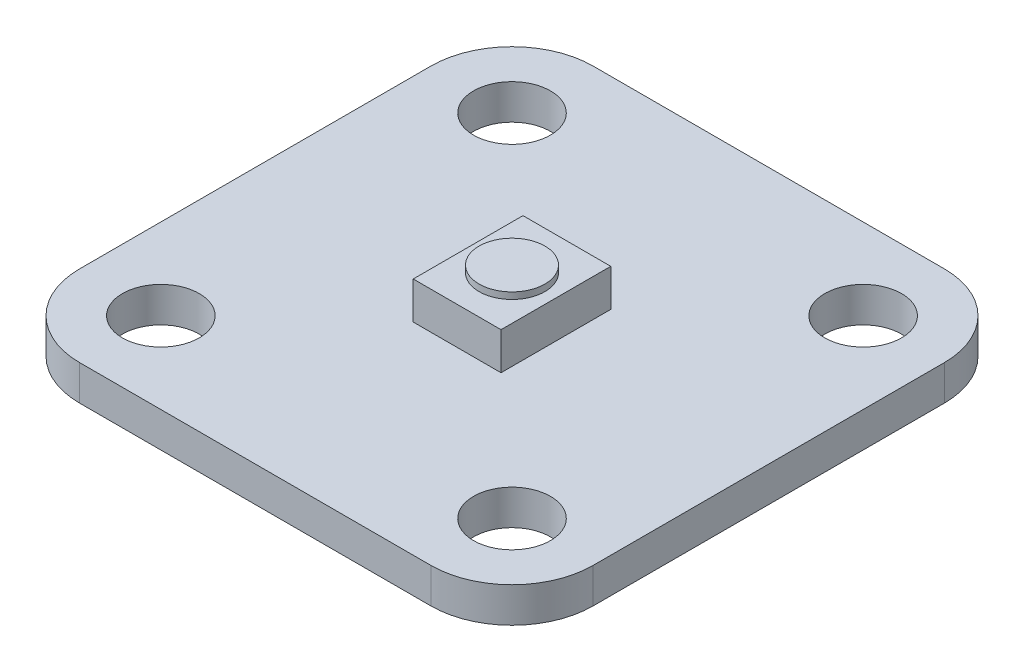
ISO-10303-21;
HEADER;
FILE_DESCRIPTION(('STEP AP214'),'2;1');
FILE_NAME('part.step','',(''),(''),'','','');
FILE_SCHEMA(('AUTOMOTIVE_DESIGN { 1 0 10303 214 1 1 1 1 }'));
ENDSEC;
DATA;
#1=APPLICATION_CONTEXT('core data for automotive mechanical design processes');
#2=APPLICATION_PROTOCOL_DEFINITION('international standard','automotive_design',2000,#1);
#3=PRODUCT_CONTEXT('',#1,'mechanical');
#4=PRODUCT('Part','Part','',(#3));
#5=PRODUCT_RELATED_PRODUCT_CATEGORY('part','',(#4));
#6=PRODUCT_DEFINITION_FORMATION('','',#4);
#7=PRODUCT_DEFINITION_CONTEXT('part definition',#1,'design');
#8=PRODUCT_DEFINITION('design','',#6,#7);
#9=PRODUCT_DEFINITION_SHAPE('','',#8);
#10=(LENGTH_UNIT() NAMED_UNIT(*) SI_UNIT(.MILLI.,.METRE.));
#11=(NAMED_UNIT(*) PLANE_ANGLE_UNIT() SI_UNIT($,.RADIAN.));
#12=(NAMED_UNIT(*) SI_UNIT($,.STERADIAN.) SOLID_ANGLE_UNIT());
#13=UNCERTAINTY_MEASURE_WITH_UNIT(LENGTH_MEASURE(1.E-05),#10,'distance_accuracy_value','');
#14=(GEOMETRIC_REPRESENTATION_CONTEXT(3) GLOBAL_UNCERTAINTY_ASSIGNED_CONTEXT((#13)) GLOBAL_UNIT_ASSIGNED_CONTEXT((#10,
#11,#12)) REPRESENTATION_CONTEXT('',''));
#15=CARTESIAN_POINT('',(0.,0.,0.));
#16=DIRECTION('',(0.,0.,1.));
#17=DIRECTION('',(1.,0.,0.));
#18=AXIS2_PLACEMENT_3D('',#15,#16,#17);
#19=CARTESIAN_POINT('',(3.7,1.6,-19.7));
#20=DIRECTION('',(0.,-1.,0.));
#21=DIRECTION('',(0.,0.,-1.));
#22=AXIS2_PLACEMENT_3D('',#19,#20,#21);
#23=PLANE('',#22);
#24=CARTESIAN_POINT('',(3.7,1.6,-3.69999999999999));
#25=DIRECTION('',(0.,1.,0.));
#26=DIRECTION('',(0.,0.,1.));
#27=AXIS2_PLACEMENT_3D('',#24,#25,#26);
#28=CIRCLE('',#27,1.75);
#29=CARTESIAN_POINT('',(3.7,1.6,-1.95));
#30=VERTEX_POINT('',#29);
#31=EDGE_CURVE('E213',#30,#30,#28,.T.);
#32=ORIENTED_EDGE('',*,*,#31,.F.);
#33=EDGE_LOOP('',(#32));
#34=FACE_BOUND('',#33,.T.);
#35=CARTESIAN_POINT('',(19.7,1.6,-3.69999999999999));
#36=DIRECTION('',(0.,1.,0.));
#37=DIRECTION('',(0.,0.,1.));
#38=AXIS2_PLACEMENT_3D('',#35,#36,#37);
#39=CIRCLE('',#38,1.75);
#40=CARTESIAN_POINT('',(19.7,1.6,-1.94999999999999));
#41=VERTEX_POINT('',#40);
#42=EDGE_CURVE('E207',#41,#41,#39,.T.);
#43=ORIENTED_EDGE('',*,*,#42,.F.);
#44=EDGE_LOOP('',(#43));
#45=FACE_BOUND('',#44,.T.);
#46=CARTESIAN_POINT('',(19.7,1.6,-19.7));
#47=DIRECTION('',(0.,1.,0.));
#48=DIRECTION('',(0.,0.,1.));
#49=AXIS2_PLACEMENT_3D('',#46,#47,#48);
#50=CIRCLE('',#49,1.75);
#51=CARTESIAN_POINT('',(19.7,1.6,-17.95));
#52=VERTEX_POINT('',#51);
#53=EDGE_CURVE('E201',#52,#52,#50,.T.);
#54=ORIENTED_EDGE('',*,*,#53,.F.);
#55=EDGE_LOOP('',(#54));
#56=FACE_BOUND('',#55,.T.);
#57=CARTESIAN_POINT('',(3.7,1.6,-19.7));
#58=DIRECTION('',(0.,1.,0.));
#59=DIRECTION('',(0.,0.,1.));
#60=AXIS2_PLACEMENT_3D('',#57,#58,#59);
#61=CIRCLE('',#60,1.75);
#62=CARTESIAN_POINT('',(3.7,1.6,-17.95));
#63=VERTEX_POINT('',#62);
#64=EDGE_CURVE('E149',#63,#63,#61,.T.);
#65=ORIENTED_EDGE('',*,*,#64,.F.);
#66=EDGE_LOOP('',(#65));
#67=FACE_BOUND('',#66,.T.);
#68=CARTESIAN_POINT('',(3.7,1.6,-19.7));
#69=DIRECTION('',(0.,1.,0.));
#70=DIRECTION('',(0.,0.,-1.));
#71=AXIS2_PLACEMENT_3D('',#68,#69,#70);
#72=CIRCLE('',#71,3.7);
#73=CARTESIAN_POINT('',(3.70000000000003,1.6,-23.4));
#74=VERTEX_POINT('',#73);
#75=CARTESIAN_POINT('',(0.,1.6,-19.7));
#76=VERTEX_POINT('',#75);
#77=EDGE_CURVE('E161',#74,#76,#72,.T.);
#78=ORIENTED_EDGE('',*,*,#77,.T.);
#79=DIRECTION('',(0.,0.,1.));
#80=VECTOR('',#79,1.);
#81=CARTESIAN_POINT('',(0.,1.6,-3.70000000000003));
#82=LINE('',#81,#80);
#83=CARTESIAN_POINT('',(0.,1.6,-3.70000000000003));
#84=VERTEX_POINT('',#83);
#85=EDGE_CURVE('E101',#76,#84,#82,.T.);
#86=ORIENTED_EDGE('',*,*,#85,.T.);
#87=CARTESIAN_POINT('',(3.7,1.6,-3.7));
#88=DIRECTION('',(0.,1.,0.));
#89=DIRECTION('',(0.,0.,-1.));
#90=AXIS2_PLACEMENT_3D('',#87,#88,#89);
#91=CIRCLE('',#90,3.7);
#92=CARTESIAN_POINT('',(3.70000000000003,1.6,0.));
#93=VERTEX_POINT('',#92);
#94=EDGE_CURVE('E192',#84,#93,#91,.T.);
#95=ORIENTED_EDGE('',*,*,#94,.T.);
#96=DIRECTION('',(1.,0.,0.));
#97=VECTOR('',#96,1.);
#98=CARTESIAN_POINT('',(3.70000000000003,1.6,0.));
#99=LINE('',#98,#97);
#100=CARTESIAN_POINT('',(19.7,1.6,0.));
#101=VERTEX_POINT('',#100);
#102=EDGE_CURVE('E191',#93,#101,#99,.T.);
#103=ORIENTED_EDGE('',*,*,#102,.T.);
#104=CARTESIAN_POINT('',(19.7,1.6,-3.7));
#105=DIRECTION('',(0.,1.,0.));
#106=DIRECTION('',(0.,0.,1.));
#107=AXIS2_PLACEMENT_3D('',#104,#105,#106);
#108=CIRCLE('',#107,3.7);
#109=CARTESIAN_POINT('',(23.4,1.6,-3.70000000000003));
#110=VERTEX_POINT('',#109);
#111=EDGE_CURVE('E124',#101,#110,#108,.T.);
#112=ORIENTED_EDGE('',*,*,#111,.T.);
#113=DIRECTION('',(0.,0.,-1.));
#114=VECTOR('',#113,1.);
#115=CARTESIAN_POINT('',(23.4,1.6,-3.70000000000003));
#116=LINE('',#115,#114);
#117=CARTESIAN_POINT('',(23.4,1.6,-19.7));
#118=VERTEX_POINT('',#117);
#119=EDGE_CURVE('E117',#110,#118,#116,.T.);
#120=ORIENTED_EDGE('',*,*,#119,.T.);
#121=CARTESIAN_POINT('',(19.7,1.6,-19.7));
#122=DIRECTION('',(0.,1.,0.));
#123=DIRECTION('',(0.,0.,-1.));
#124=AXIS2_PLACEMENT_3D('',#121,#122,#123);
#125=CIRCLE('',#124,3.7);
#126=CARTESIAN_POINT('',(19.7,1.6,-23.4));
#127=VERTEX_POINT('',#126);
#128=EDGE_CURVE('E121',#118,#127,#125,.T.);
#129=ORIENTED_EDGE('',*,*,#128,.T.);
#130=DIRECTION('',(-1.,0.,0.));
#131=VECTOR('',#130,1.);
#132=CARTESIAN_POINT('',(3.70000000000003,1.6,-23.4));
#133=LINE('',#132,#131);
#134=EDGE_CURVE('E59',#127,#74,#133,.T.);
#135=ORIENTED_EDGE('',*,*,#134,.T.);
#136=EDGE_LOOP('',(#78,#86,#95,#103,#112,#120,#129,#135));
#137=FACE_BOUND('',#136,.T.);
#138=DIRECTION('',(1.,0.,0.));
#139=VECTOR('',#138,1.);
#140=CARTESIAN_POINT('',(0.,1.6,-9.2));
#141=LINE('',#140,#139);
#142=CARTESIAN_POINT('',(9.7,1.6,-9.2));
#143=VERTEX_POINT('',#142);
#144=CARTESIAN_POINT('',(13.7,1.6,-9.2));
#145=VERTEX_POINT('',#144);
#146=EDGE_CURVE('E240',#143,#145,#141,.T.);
#147=ORIENTED_EDGE('',*,*,#146,.F.);
#148=DIRECTION('',(0.,0.,-1.));
#149=VECTOR('',#148,1.);
#150=CARTESIAN_POINT('',(9.7,1.6,0.));
#151=LINE('',#150,#149);
#152=CARTESIAN_POINT('',(9.7,1.6,-14.2));
#153=VERTEX_POINT('',#152);
#154=EDGE_CURVE('E232',#143,#153,#151,.T.);
#155=ORIENTED_EDGE('',*,*,#154,.T.);
#156=DIRECTION('',(1.,0.,0.));
#157=VECTOR('',#156,1.);
#158=CARTESIAN_POINT('',(0.,1.6,-14.2));
#159=LINE('',#158,#157);
#160=CARTESIAN_POINT('',(13.7,1.6,-14.2));
#161=VERTEX_POINT('',#160);
#162=EDGE_CURVE('E50',#153,#161,#159,.T.);
#163=ORIENTED_EDGE('',*,*,#162,.T.);
#164=DIRECTION('',(0.,0.,-1.));
#165=VECTOR('',#164,1.);
#166=CARTESIAN_POINT('',(13.7,1.6,0.));
#167=LINE('',#166,#165);
#168=EDGE_CURVE('E237',#145,#161,#167,.T.);
#169=ORIENTED_EDGE('',*,*,#168,.F.);
#170=EDGE_LOOP('',(#147,#155,#163,#169));
#171=FACE_BOUND('',#170,.T.);
#172=ADVANCED_FACE('F34',(#34,#45,#56,#67,#137,#171),#23,.F.);
#173=CARTESIAN_POINT('',(3.7,0.,-19.7));
#174=DIRECTION('',(0.,-1.,0.));
#175=DIRECTION('',(0.,0.,-1.));
#176=AXIS2_PLACEMENT_3D('',#173,#174,#175);
#177=PLANE('',#176);
#178=CARTESIAN_POINT('',(19.7,0.,-3.69999999999999));
#179=DIRECTION('',(0.,1.,0.));
#180=DIRECTION('',(0.,0.,1.));
#181=AXIS2_PLACEMENT_3D('',#178,#179,#180);
#182=CIRCLE('',#181,1.75);
#183=CARTESIAN_POINT('',(19.7,0.,-1.94999999999999));
#184=VERTEX_POINT('',#183);
#185=EDGE_CURVE('E210',#184,#184,#182,.T.);
#186=ORIENTED_EDGE('',*,*,#185,.T.);
#187=EDGE_LOOP('',(#186));
#188=FACE_BOUND('',#187,.T.);
#189=CARTESIAN_POINT('',(3.7,0.,-19.7));
#190=DIRECTION('',(0.,1.,0.));
#191=DIRECTION('',(0.,0.,1.));
#192=AXIS2_PLACEMENT_3D('',#189,#190,#191);
#193=CIRCLE('',#192,1.75);
#194=CARTESIAN_POINT('',(3.7,0.,-17.95));
#195=VERTEX_POINT('',#194);
#196=EDGE_CURVE('E198',#195,#195,#193,.T.);
#197=ORIENTED_EDGE('',*,*,#196,.T.);
#198=EDGE_LOOP('',(#197));
#199=FACE_BOUND('',#198,.T.);
#200=CARTESIAN_POINT('',(3.7,0.,-19.7));
#201=DIRECTION('',(0.,1.,0.));
#202=DIRECTION('',(0.,0.,-1.));
#203=AXIS2_PLACEMENT_3D('',#200,#201,#202);
#204=CIRCLE('',#203,3.7);
#205=CARTESIAN_POINT('',(3.70000000000003,0.,-23.4));
#206=VERTEX_POINT('',#205);
#207=CARTESIAN_POINT('',(0.,0.,-19.7));
#208=VERTEX_POINT('',#207);
#209=EDGE_CURVE('E145',#206,#208,#204,.T.);
#210=ORIENTED_EDGE('',*,*,#209,.F.);
#211=DIRECTION('',(-1.,0.,0.));
#212=VECTOR('',#211,1.);
#213=CARTESIAN_POINT('',(3.70000000000003,0.,-23.4));
#214=LINE('',#213,#212);
#215=CARTESIAN_POINT('',(19.7,0.,-23.4));
#216=VERTEX_POINT('',#215);
#217=EDGE_CURVE('E92',#216,#206,#214,.T.);
#218=ORIENTED_EDGE('',*,*,#217,.F.);
#219=CARTESIAN_POINT('',(19.7,0.,-19.7));
#220=DIRECTION('',(0.,1.,0.));
#221=DIRECTION('',(0.,0.,-1.));
#222=AXIS2_PLACEMENT_3D('',#219,#220,#221);
#223=CIRCLE('',#222,3.7);
#224=CARTESIAN_POINT('',(23.4,0.,-19.7));
#225=VERTEX_POINT('',#224);
#226=EDGE_CURVE('E158',#225,#216,#223,.T.);
#227=ORIENTED_EDGE('',*,*,#226,.F.);
#228=DIRECTION('',(0.,0.,-1.));
#229=VECTOR('',#228,1.);
#230=CARTESIAN_POINT('',(23.4,0.,-3.70000000000003));
#231=LINE('',#230,#229);
#232=CARTESIAN_POINT('',(23.4,0.,-3.70000000000003));
#233=VERTEX_POINT('',#232);
#234=EDGE_CURVE('E133',#233,#225,#231,.T.);
#235=ORIENTED_EDGE('',*,*,#234,.F.);
#236=CARTESIAN_POINT('',(19.7,0.,-3.7));
#237=DIRECTION('',(0.,1.,0.));
#238=DIRECTION('',(0.,0.,1.));
#239=AXIS2_PLACEMENT_3D('',#236,#237,#238);
#240=CIRCLE('',#239,3.7);
#241=CARTESIAN_POINT('',(19.7,0.,0.));
#242=VERTEX_POINT('',#241);
#243=EDGE_CURVE('E155',#242,#233,#240,.T.);
#244=ORIENTED_EDGE('',*,*,#243,.F.);
#245=DIRECTION('',(1.,0.,0.));
#246=VECTOR('',#245,1.);
#247=CARTESIAN_POINT('',(3.70000000000003,0.,0.));
#248=LINE('',#247,#246);
#249=CARTESIAN_POINT('',(3.70000000000003,0.,0.));
#250=VERTEX_POINT('',#249);
#251=EDGE_CURVE('E153',#250,#242,#248,.T.);
#252=ORIENTED_EDGE('',*,*,#251,.F.);
#253=CARTESIAN_POINT('',(3.7,0.,-3.7));
#254=DIRECTION('',(0.,1.,0.));
#255=DIRECTION('',(0.,0.,-1.));
#256=AXIS2_PLACEMENT_3D('',#253,#254,#255);
#257=CIRCLE('',#256,3.7);
#258=CARTESIAN_POINT('',(0.,0.,-3.70000000000003));
#259=VERTEX_POINT('',#258);
#260=EDGE_CURVE('E151',#259,#250,#257,.T.);
#261=ORIENTED_EDGE('',*,*,#260,.F.);
#262=DIRECTION('',(0.,0.,1.));
#263=VECTOR('',#262,1.);
#264=CARTESIAN_POINT('',(0.,0.,-3.70000000000003));
#265=LINE('',#264,#263);
#266=EDGE_CURVE('E148',#208,#259,#265,.T.);
#267=ORIENTED_EDGE('',*,*,#266,.F.);
#268=EDGE_LOOP('',(#210,#218,#227,#235,#244,#252,#261,#267));
#269=FACE_BOUND('',#268,.T.);
#270=CARTESIAN_POINT('',(19.7,0.,-19.7));
#271=DIRECTION('',(0.,1.,0.));
#272=DIRECTION('',(0.,0.,1.));
#273=AXIS2_PLACEMENT_3D('',#270,#271,#272);
#274=CIRCLE('',#273,1.75);
#275=CARTESIAN_POINT('',(19.7,0.,-17.95));
#276=VERTEX_POINT('',#275);
#277=EDGE_CURVE('E204',#276,#276,#274,.T.);
#278=ORIENTED_EDGE('',*,*,#277,.T.);
#279=EDGE_LOOP('',(#278));
#280=FACE_BOUND('',#279,.T.);
#281=CARTESIAN_POINT('',(3.7,0.,-3.69999999999999));
#282=DIRECTION('',(0.,1.,0.));
#283=DIRECTION('',(0.,0.,1.));
#284=AXIS2_PLACEMENT_3D('',#281,#282,#283);
#285=CIRCLE('',#284,1.75);
#286=CARTESIAN_POINT('',(3.7,0.,-1.95));
#287=VERTEX_POINT('',#286);
#288=EDGE_CURVE('E216',#287,#287,#285,.T.);
#289=ORIENTED_EDGE('',*,*,#288,.T.);
#290=EDGE_LOOP('',(#289));
#291=FACE_BOUND('',#290,.T.);
#292=ADVANCED_FACE('F181',(#188,#199,#269,#280,#291),#177,.T.);
#293=CARTESIAN_POINT('',(3.7,1.6,-19.7));
#294=DIRECTION('',(0.,-1.,0.));
#295=DIRECTION('',(0.,0.,-1.));
#296=AXIS2_PLACEMENT_3D('',#293,#294,#295);
#297=CYLINDRICAL_SURFACE('',#296,3.7);
#298=ORIENTED_EDGE('',*,*,#209,.T.);
#299=DIRECTION('',(0.,-1.,0.));
#300=VECTOR('',#299,1.);
#301=CARTESIAN_POINT('',(0.,1.6,-19.7));
#302=LINE('',#301,#300);
#303=EDGE_CURVE('E38',#76,#208,#302,.T.);
#304=ORIENTED_EDGE('',*,*,#303,.F.);
#305=ORIENTED_EDGE('',*,*,#77,.F.);
#306=DIRECTION('',(0.,-1.,0.));
#307=VECTOR('',#306,1.);
#308=CARTESIAN_POINT('',(3.70000000000003,1.6,-23.4));
#309=LINE('',#308,#307);
#310=EDGE_CURVE('E141',#74,#206,#309,.T.);
#311=ORIENTED_EDGE('',*,*,#310,.T.);
#312=EDGE_LOOP('',(#298,#304,#305,#311));
#313=FACE_BOUND('',#312,.T.);
#314=ADVANCED_FACE('F36',(#313),#297,.T.);
#315=CARTESIAN_POINT('',(0.,1.6,-3.70000000000003));
#316=DIRECTION('',(1.,0.,0.));
#317=DIRECTION('',(0.,0.,-1.));
#318=AXIS2_PLACEMENT_3D('',#315,#316,#317);
#319=PLANE('',#318);
#320=ORIENTED_EDGE('',*,*,#266,.T.);
#321=DIRECTION('',(0.,-1.,0.));
#322=VECTOR('',#321,1.);
#323=CARTESIAN_POINT('',(0.,1.6,-3.70000000000003));
#324=LINE('',#323,#322);
#325=EDGE_CURVE('E170',#84,#259,#324,.T.);
#326=ORIENTED_EDGE('',*,*,#325,.F.);
#327=ORIENTED_EDGE('',*,*,#85,.F.);
#328=ORIENTED_EDGE('',*,*,#303,.T.);
#329=EDGE_LOOP('',(#320,#326,#327,#328));
#330=FACE_BOUND('',#329,.T.);
#331=ADVANCED_FACE('F176',(#330),#319,.F.);
#332=CARTESIAN_POINT('',(3.7,1.6,-3.7));
#333=DIRECTION('',(0.,-1.,0.));
#334=DIRECTION('',(0.,0.,-1.));
#335=AXIS2_PLACEMENT_3D('',#332,#333,#334);
#336=CYLINDRICAL_SURFACE('',#335,3.7);
#337=ORIENTED_EDGE('',*,*,#260,.T.);
#338=DIRECTION('',(0.,-1.,0.));
#339=VECTOR('',#338,1.);
#340=CARTESIAN_POINT('',(3.70000000000003,1.6,0.));
#341=LINE('',#340,#339);
#342=EDGE_CURVE('E168',#93,#250,#341,.T.);
#343=ORIENTED_EDGE('',*,*,#342,.F.);
#344=ORIENTED_EDGE('',*,*,#94,.F.);
#345=ORIENTED_EDGE('',*,*,#325,.T.);
#346=EDGE_LOOP('',(#337,#343,#344,#345));
#347=FACE_BOUND('',#346,.T.);
#348=ADVANCED_FACE('F186',(#347),#336,.T.);
#349=CARTESIAN_POINT('',(3.70000000000003,1.6,0.));
#350=DIRECTION('',(0.,0.,-1.));
#351=DIRECTION('',(-1.,0.,0.));
#352=AXIS2_PLACEMENT_3D('',#349,#350,#351);
#353=PLANE('',#352);
#354=ORIENTED_EDGE('',*,*,#251,.T.);
#355=DIRECTION('',(0.,-1.,0.));
#356=VECTOR('',#355,1.);
#357=CARTESIAN_POINT('',(19.7,1.6,0.));
#358=LINE('',#357,#356);
#359=EDGE_CURVE('E165',#101,#242,#358,.T.);
#360=ORIENTED_EDGE('',*,*,#359,.F.);
#361=ORIENTED_EDGE('',*,*,#102,.F.);
#362=ORIENTED_EDGE('',*,*,#342,.T.);
#363=EDGE_LOOP('',(#354,#360,#361,#362));
#364=FACE_BOUND('',#363,.T.);
#365=ADVANCED_FACE('F189',(#364),#353,.F.);
#366=CARTESIAN_POINT('',(19.7,1.6,-3.7));
#367=DIRECTION('',(0.,-1.,0.));
#368=DIRECTION('',(0.,0.,-1.));
#369=AXIS2_PLACEMENT_3D('',#366,#367,#368);
#370=CYLINDRICAL_SURFACE('',#369,3.7);
#371=ORIENTED_EDGE('',*,*,#243,.T.);
#372=DIRECTION('',(0.,-1.,0.));
#373=VECTOR('',#372,1.);
#374=CARTESIAN_POINT('',(23.4,1.6,-3.70000000000003));
#375=LINE('',#374,#373);
#376=EDGE_CURVE('E136',#110,#233,#375,.T.);
#377=ORIENTED_EDGE('',*,*,#376,.F.);
#378=ORIENTED_EDGE('',*,*,#111,.F.);
#379=ORIENTED_EDGE('',*,*,#359,.T.);
#380=EDGE_LOOP('',(#371,#377,#378,#379));
#381=FACE_BOUND('',#380,.T.);
#382=ADVANCED_FACE('F317',(#381),#370,.T.);
#383=CARTESIAN_POINT('',(23.4,1.6,-3.70000000000003));
#384=DIRECTION('',(-1.,0.,0.));
#385=DIRECTION('',(0.,0.,1.));
#386=AXIS2_PLACEMENT_3D('',#383,#384,#385);
#387=PLANE('',#386);
#388=ORIENTED_EDGE('',*,*,#234,.T.);
#389=DIRECTION('',(0.,-1.,0.));
#390=VECTOR('',#389,1.);
#391=CARTESIAN_POINT('',(23.4,1.6,-19.7));
#392=LINE('',#391,#390);
#393=EDGE_CURVE('E130',#118,#225,#392,.T.);
#394=ORIENTED_EDGE('',*,*,#393,.F.);
#395=ORIENTED_EDGE('',*,*,#119,.F.);
#396=ORIENTED_EDGE('',*,*,#376,.T.);
#397=EDGE_LOOP('',(#388,#394,#395,#396));
#398=FACE_BOUND('',#397,.T.);
#399=ADVANCED_FACE('F131',(#398),#387,.F.);
#400=CARTESIAN_POINT('',(19.7,1.6,-19.7));
#401=DIRECTION('',(0.,-1.,0.));
#402=DIRECTION('',(0.,0.,-1.));
#403=AXIS2_PLACEMENT_3D('',#400,#401,#402);
#404=CYLINDRICAL_SURFACE('',#403,3.7);
#405=ORIENTED_EDGE('',*,*,#226,.T.);
#406=DIRECTION('',(0.,-1.,0.));
#407=VECTOR('',#406,1.);
#408=CARTESIAN_POINT('',(19.7,1.6,-23.4));
#409=LINE('',#408,#407);
#410=EDGE_CURVE('E137',#127,#216,#409,.T.);
#411=ORIENTED_EDGE('',*,*,#410,.F.);
#412=ORIENTED_EDGE('',*,*,#128,.F.);
#413=ORIENTED_EDGE('',*,*,#393,.T.);
#414=EDGE_LOOP('',(#405,#411,#412,#413));
#415=FACE_BOUND('',#414,.T.);
#416=ADVANCED_FACE('F139',(#415),#404,.T.);
#417=CARTESIAN_POINT('',(3.70000000000003,1.6,-23.4));
#418=DIRECTION('',(0.,0.,1.));
#419=DIRECTION('',(1.,0.,0.));
#420=AXIS2_PLACEMENT_3D('',#417,#418,#419);
#421=PLANE('',#420);
#422=ORIENTED_EDGE('',*,*,#217,.T.);
#423=ORIENTED_EDGE('',*,*,#310,.F.);
#424=ORIENTED_EDGE('',*,*,#134,.F.);
#425=ORIENTED_EDGE('',*,*,#410,.T.);
#426=EDGE_LOOP('',(#422,#423,#424,#425));
#427=FACE_BOUND('',#426,.T.);
#428=ADVANCED_FACE('F310',(#427),#421,.F.);
#429=CARTESIAN_POINT('',(3.7,1.6,-19.7));
#430=DIRECTION('',(0.,-1.,0.));
#431=DIRECTION('',(0.,0.,-1.));
#432=AXIS2_PLACEMENT_3D('',#429,#430,#431);
#433=CYLINDRICAL_SURFACE('',#432,1.75);
#434=ORIENTED_EDGE('',*,*,#64,.T.);
#435=EDGE_LOOP('',(#434));
#436=FACE_BOUND('',#435,.T.);
#437=ORIENTED_EDGE('',*,*,#196,.F.);
#438=EDGE_LOOP('',(#437));
#439=FACE_BOUND('',#438,.T.);
#440=ADVANCED_FACE('F307',(#436,#439),#433,.F.);
#441=CARTESIAN_POINT('',(19.7,1.6,-19.7));
#442=DIRECTION('',(0.,-1.,0.));
#443=DIRECTION('',(0.,0.,-1.));
#444=AXIS2_PLACEMENT_3D('',#441,#442,#443);
#445=CYLINDRICAL_SURFACE('',#444,1.75);
#446=ORIENTED_EDGE('',*,*,#53,.T.);
#447=EDGE_LOOP('',(#446));
#448=FACE_BOUND('',#447,.T.);
#449=ORIENTED_EDGE('',*,*,#277,.F.);
#450=EDGE_LOOP('',(#449));
#451=FACE_BOUND('',#450,.T.);
#452=ADVANCED_FACE('F380',(#448,#451),#445,.F.);
#453=CARTESIAN_POINT('',(19.7,1.6,-3.69999999999999));
#454=DIRECTION('',(0.,-1.,0.));
#455=DIRECTION('',(0.,0.,-1.));
#456=AXIS2_PLACEMENT_3D('',#453,#454,#455);
#457=CYLINDRICAL_SURFACE('',#456,1.75);
#458=ORIENTED_EDGE('',*,*,#42,.T.);
#459=EDGE_LOOP('',(#458));
#460=FACE_BOUND('',#459,.T.);
#461=ORIENTED_EDGE('',*,*,#185,.F.);
#462=EDGE_LOOP('',(#461));
#463=FACE_BOUND('',#462,.T.);
#464=ADVANCED_FACE('F388',(#460,#463),#457,.F.);
#465=CARTESIAN_POINT('',(3.7,1.6,-3.69999999999999));
#466=DIRECTION('',(0.,-1.,0.));
#467=DIRECTION('',(0.,0.,-1.));
#468=AXIS2_PLACEMENT_3D('',#465,#466,#467);
#469=CYLINDRICAL_SURFACE('',#468,1.75);
#470=ORIENTED_EDGE('',*,*,#31,.T.);
#471=EDGE_LOOP('',(#470));
#472=FACE_BOUND('',#471,.T.);
#473=ORIENTED_EDGE('',*,*,#288,.F.);
#474=EDGE_LOOP('',(#473));
#475=FACE_BOUND('',#474,.T.);
#476=ADVANCED_FACE('F396',(#472,#475),#469,.F.);
#477=CARTESIAN_POINT('',(0.,3.3,-9.2));
#478=DIRECTION('',(0.,0.,-1.));
#479=DIRECTION('',(-1.,0.,0.));
#480=AXIS2_PLACEMENT_3D('',#477,#478,#479);
#481=PLANE('',#480);
#482=ORIENTED_EDGE('',*,*,#146,.T.);
#483=DIRECTION('',(0.,-1.,0.));
#484=VECTOR('',#483,1.);
#485=CARTESIAN_POINT('',(13.7,3.3,-9.2));
#486=LINE('',#485,#484);
#487=CARTESIAN_POINT('',(13.7,3.3,-9.2));
#488=VERTEX_POINT('',#487);
#489=EDGE_CURVE('E219',#488,#145,#486,.T.);
#490=ORIENTED_EDGE('',*,*,#489,.F.);
#491=DIRECTION('',(1.,0.,0.));
#492=VECTOR('',#491,1.);
#493=CARTESIAN_POINT('',(0.,3.3,-9.2));
#494=LINE('',#493,#492);
#495=CARTESIAN_POINT('',(9.7,3.3,-9.2));
#496=VERTEX_POINT('',#495);
#497=EDGE_CURVE('E235',#496,#488,#494,.T.);
#498=ORIENTED_EDGE('',*,*,#497,.F.);
#499=DIRECTION('',(0.,-1.,0.));
#500=VECTOR('',#499,1.);
#501=CARTESIAN_POINT('',(9.7,3.3,-9.2));
#502=LINE('',#501,#500);
#503=EDGE_CURVE('E228',#496,#143,#502,.T.);
#504=ORIENTED_EDGE('',*,*,#503,.T.);
#505=EDGE_LOOP('',(#482,#490,#498,#504));
#506=FACE_BOUND('',#505,.T.);
#507=ADVANCED_FACE('F280',(#506),#481,.F.);
#508=CARTESIAN_POINT('',(13.7,3.3,0.));
#509=DIRECTION('',(-1.,0.,0.));
#510=DIRECTION('',(0.,0.,1.));
#511=AXIS2_PLACEMENT_3D('',#508,#509,#510);
#512=PLANE('',#511);
#513=ORIENTED_EDGE('',*,*,#168,.T.);
#514=DIRECTION('',(0.,-1.,0.));
#515=VECTOR('',#514,1.);
#516=CARTESIAN_POINT('',(13.7,3.3,-14.2));
#517=LINE('',#516,#515);
#518=CARTESIAN_POINT('',(13.7,3.3,-14.2));
#519=VERTEX_POINT('',#518);
#520=EDGE_CURVE('E224',#519,#161,#517,.T.);
#521=ORIENTED_EDGE('',*,*,#520,.F.);
#522=DIRECTION('',(0.,0.,-1.));
#523=VECTOR('',#522,1.);
#524=CARTESIAN_POINT('',(13.7,3.3,0.));
#525=LINE('',#524,#523);
#526=EDGE_CURVE('E249',#488,#519,#525,.T.);
#527=ORIENTED_EDGE('',*,*,#526,.F.);
#528=ORIENTED_EDGE('',*,*,#489,.T.);
#529=EDGE_LOOP('',(#513,#521,#527,#528));
#530=FACE_BOUND('',#529,.T.);
#531=ADVANCED_FACE('F285',(#530),#512,.F.);
#532=CARTESIAN_POINT('',(0.,3.3,-14.2));
#533=DIRECTION('',(0.,0.,-1.));
#534=DIRECTION('',(-1.,0.,0.));
#535=AXIS2_PLACEMENT_3D('',#532,#533,#534);
#536=PLANE('',#535);
#537=ORIENTED_EDGE('',*,*,#162,.F.);
#538=DIRECTION('',(0.,-1.,0.));
#539=VECTOR('',#538,1.);
#540=CARTESIAN_POINT('',(9.7,3.3,-14.2));
#541=LINE('',#540,#539);
#542=CARTESIAN_POINT('',(9.7,3.3,-14.2));
#543=VERTEX_POINT('',#542);
#544=EDGE_CURVE('E226',#543,#153,#541,.T.);
#545=ORIENTED_EDGE('',*,*,#544,.F.);
#546=DIRECTION('',(1.,0.,0.));
#547=VECTOR('',#546,1.);
#548=CARTESIAN_POINT('',(0.,3.3,-14.2));
#549=LINE('',#548,#547);
#550=EDGE_CURVE('E246',#543,#519,#549,.T.);
#551=ORIENTED_EDGE('',*,*,#550,.T.);
#552=ORIENTED_EDGE('',*,*,#520,.T.);
#553=EDGE_LOOP('',(#537,#545,#551,#552));
#554=FACE_BOUND('',#553,.T.);
#555=ADVANCED_FACE('F293',(#554),#536,.T.);
#556=CARTESIAN_POINT('',(9.7,3.3,0.));
#557=DIRECTION('',(-1.,0.,0.));
#558=DIRECTION('',(0.,0.,1.));
#559=AXIS2_PLACEMENT_3D('',#556,#557,#558);
#560=PLANE('',#559);
#561=ORIENTED_EDGE('',*,*,#154,.F.);
#562=ORIENTED_EDGE('',*,*,#503,.F.);
#563=DIRECTION('',(0.,0.,-1.));
#564=VECTOR('',#563,1.);
#565=CARTESIAN_POINT('',(9.7,3.3,0.));
#566=LINE('',#565,#564);
#567=EDGE_CURVE('E231',#496,#543,#566,.T.);
#568=ORIENTED_EDGE('',*,*,#567,.T.);
#569=ORIENTED_EDGE('',*,*,#544,.T.);
#570=EDGE_LOOP('',(#561,#562,#568,#569));
#571=FACE_BOUND('',#570,.T.);
#572=ADVANCED_FACE('F268',(#571),#560,.T.);
#573=CARTESIAN_POINT('',(0.,3.3,0.));
#574=DIRECTION('',(0.,1.,0.));
#575=DIRECTION('',(0.,0.,1.));
#576=AXIS2_PLACEMENT_3D('',#573,#574,#575);
#577=PLANE('',#576);
#578=CARTESIAN_POINT('',(11.7,3.3,-11.7));
#579=DIRECTION('',(0.,1.,0.));
#580=DIRECTION('',(0.,0.,1.));
#581=AXIS2_PLACEMENT_3D('',#578,#579,#580);
#582=CIRCLE('',#581,1.5);
#583=CARTESIAN_POINT('',(11.7,3.3,-10.2));
#584=VERTEX_POINT('',#583);
#585=EDGE_CURVE('E11',#584,#584,#582,.T.);
#586=ORIENTED_EDGE('',*,*,#585,.F.);
#587=EDGE_LOOP('',(#586));
#588=FACE_BOUND('',#587,.T.);
#589=ORIENTED_EDGE('',*,*,#497,.T.);
#590=ORIENTED_EDGE('',*,*,#526,.T.);
#591=ORIENTED_EDGE('',*,*,#550,.F.);
#592=ORIENTED_EDGE('',*,*,#567,.F.);
#593=EDGE_LOOP('',(#589,#590,#591,#592));
#594=FACE_BOUND('',#593,.T.);
#595=ADVANCED_FACE('F262',(#588,#594),#577,.T.);
#596=CARTESIAN_POINT('',(11.7,3.6,-11.7));
#597=DIRECTION('',(0.,-1.,0.));
#598=DIRECTION('',(0.,0.,-1.));
#599=AXIS2_PLACEMENT_3D('',#596,#597,#598);
#600=CYLINDRICAL_SURFACE('',#599,1.5);
#601=CARTESIAN_POINT('',(11.7,3.6,-11.7));
#602=DIRECTION('',(0.,1.,0.));
#603=DIRECTION('',(0.,0.,1.));
#604=AXIS2_PLACEMENT_3D('',#601,#602,#603);
#605=CIRCLE('',#604,1.5);
#606=CARTESIAN_POINT('',(11.7,3.6,-10.2));
#607=VERTEX_POINT('',#606);
#608=EDGE_CURVE('E243',#607,#607,#605,.T.);
#609=ORIENTED_EDGE('',*,*,#608,.F.);
#610=EDGE_LOOP('',(#609));
#611=FACE_BOUND('',#610,.T.);
#612=ORIENTED_EDGE('',*,*,#585,.T.);
#613=EDGE_LOOP('',(#612));
#614=FACE_BOUND('',#613,.T.);
#615=ADVANCED_FACE('F259',(#611,#614),#600,.T.);
#616=CARTESIAN_POINT('',(11.7,3.6,-11.7));
#617=DIRECTION('',(0.,1.,0.));
#618=DIRECTION('',(0.,0.,1.));
#619=AXIS2_PLACEMENT_3D('',#616,#617,#618);
#620=PLANE('',#619);
#621=ORIENTED_EDGE('',*,*,#608,.T.);
#622=EDGE_LOOP('',(#621));
#623=FACE_BOUND('',#622,.T.);
#624=ADVANCED_FACE('F257',(#623),#620,.T.);
#625=CLOSED_SHELL('',(#172,#292,#314,#331,#348,#365,#382,#399,#416,#428,#440,#452,#464,#476,
#507,#531,#555,#572,#595,#615,#624));
#626=MANIFOLD_SOLID_BREP('B2',#625);
#627=ADVANCED_BREP_SHAPE_REPRESENTATION('',(#18,#626),#14);
#628=SHAPE_DEFINITION_REPRESENTATION(#9,#627);
ENDSEC;
END-ISO-10303-21;
